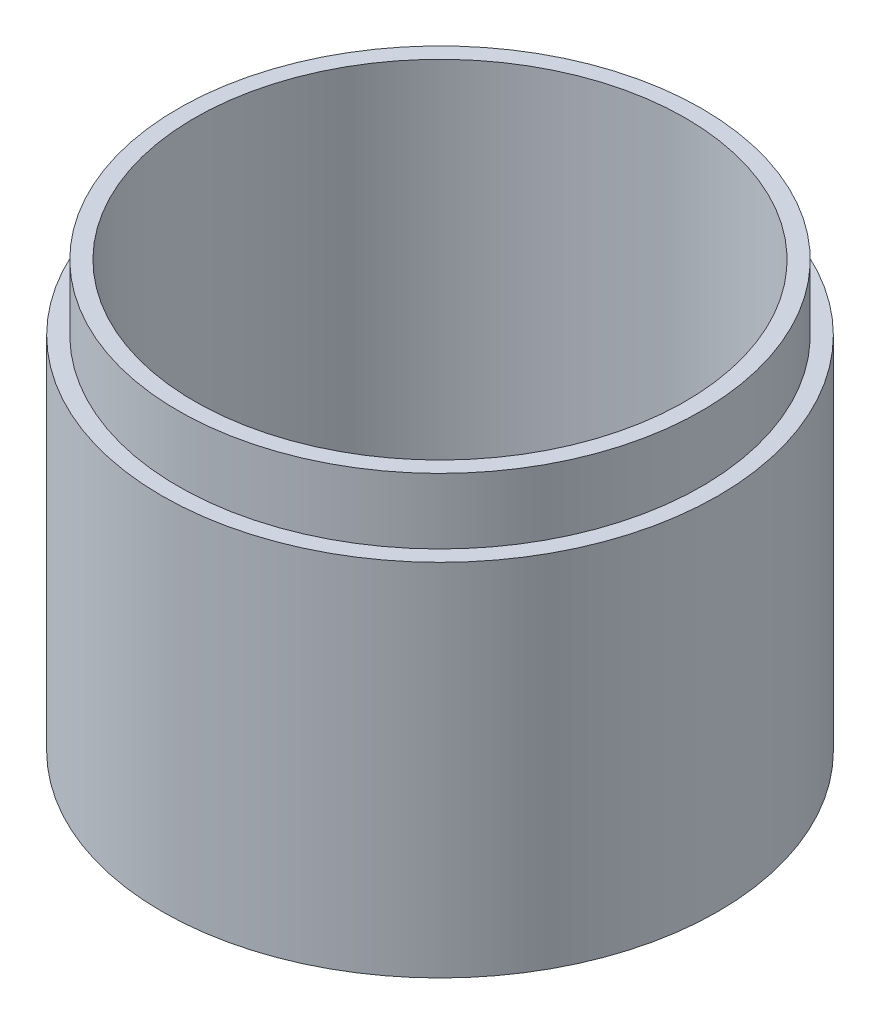
ISO-10303-21;
HEADER;
FILE_DESCRIPTION(('STEP AP214'),'2;1');
FILE_NAME('part.step','',(''),(''),'','','');
FILE_SCHEMA(('AUTOMOTIVE_DESIGN { 1 0 10303 214 1 1 1 1 }'));
ENDSEC;
DATA;
#1=APPLICATION_CONTEXT('core data for automotive mechanical design processes');
#2=APPLICATION_PROTOCOL_DEFINITION('international standard','automotive_design',2000,#1);
#3=PRODUCT_CONTEXT('',#1,'mechanical');
#4=PRODUCT('Part','Part','',(#3));
#5=PRODUCT_RELATED_PRODUCT_CATEGORY('part','',(#4));
#6=PRODUCT_DEFINITION_FORMATION('','',#4);
#7=PRODUCT_DEFINITION_CONTEXT('part definition',#1,'design');
#8=PRODUCT_DEFINITION('design','',#6,#7);
#9=PRODUCT_DEFINITION_SHAPE('','',#8);
#10=(LENGTH_UNIT() NAMED_UNIT(*) SI_UNIT(.MILLI.,.METRE.));
#11=(NAMED_UNIT(*) PLANE_ANGLE_UNIT() SI_UNIT($,.RADIAN.));
#12=(NAMED_UNIT(*) SI_UNIT($,.STERADIAN.) SOLID_ANGLE_UNIT());
#13=UNCERTAINTY_MEASURE_WITH_UNIT(LENGTH_MEASURE(1.E-05),#10,'distance_accuracy_value','');
#14=(GEOMETRIC_REPRESENTATION_CONTEXT(3) GLOBAL_UNCERTAINTY_ASSIGNED_CONTEXT((#13)) GLOBAL_UNIT_ASSIGNED_CONTEXT((#10,
#11,#12)) REPRESENTATION_CONTEXT('',''));
#15=CARTESIAN_POINT('',(0.,0.,0.));
#16=DIRECTION('',(0.,0.,1.));
#17=DIRECTION('',(1.,0.,0.));
#18=AXIS2_PLACEMENT_3D('',#15,#16,#17);
#19=CARTESIAN_POINT('',(-17.,0.,0.));
#20=DIRECTION('',(0.,1.,0.));
#21=DIRECTION('',(0.,0.,1.));
#22=AXIS2_PLACEMENT_3D('',#19,#20,#21);
#23=PLANE('',#22);
#24=CARTESIAN_POINT('',(0.,0.,0.));
#25=DIRECTION('',(0.,-1.,0.));
#26=DIRECTION('',(0.,0.,-1.));
#27=AXIS2_PLACEMENT_3D('',#24,#25,#26);
#28=CIRCLE('',#27,15.);
#29=CARTESIAN_POINT('',(0.,0.,-15.));
#30=VERTEX_POINT('',#29);
#31=EDGE_CURVE('E10',#30,#30,#28,.T.);
#32=ORIENTED_EDGE('',*,*,#31,.F.);
#33=EDGE_LOOP('',(#32));
#34=FACE_BOUND('',#33,.T.);
#35=CARTESIAN_POINT('',(0.,0.,0.));
#36=DIRECTION('',(0.,-1.,0.));
#37=DIRECTION('',(0.,0.,-1.));
#38=AXIS2_PLACEMENT_3D('',#35,#36,#37);
#39=CIRCLE('',#38,17.);
#40=CARTESIAN_POINT('',(0.,0.,-17.));
#41=VERTEX_POINT('',#40);
#42=EDGE_CURVE('E56',#41,#41,#39,.T.);
#43=ORIENTED_EDGE('',*,*,#42,.T.);
#44=EDGE_LOOP('',(#43));
#45=FACE_BOUND('',#44,.T.);
#46=ADVANCED_FACE('F34',(#34,#45),#23,.F.);
#47=CARTESIAN_POINT('',(0.,0.,0.));
#48=DIRECTION('',(0.,-1.,0.));
#49=DIRECTION('',(0.,0.,-1.));
#50=AXIS2_PLACEMENT_3D('',#47,#48,#49);
#51=CYLINDRICAL_SURFACE('',#50,15.);
#52=CARTESIAN_POINT('',(0.,26.,0.));
#53=DIRECTION('',(0.,-1.,0.));
#54=DIRECTION('',(0.,0.,-1.));
#55=AXIS2_PLACEMENT_3D('',#52,#53,#54);
#56=CIRCLE('',#55,15.);
#57=CARTESIAN_POINT('',(0.,26.,-15.));
#58=VERTEX_POINT('',#57);
#59=EDGE_CURVE('E40',#58,#58,#56,.T.);
#60=ORIENTED_EDGE('',*,*,#59,.F.);
#61=EDGE_LOOP('',(#60));
#62=FACE_BOUND('',#61,.T.);
#63=ORIENTED_EDGE('',*,*,#31,.T.);
#64=EDGE_LOOP('',(#63));
#65=FACE_BOUND('',#64,.T.);
#66=ADVANCED_FACE('F81',(#62,#65),#51,.F.);
#67=CARTESIAN_POINT('',(-15.,26.,0.));
#68=DIRECTION('',(0.,-1.,0.));
#69=DIRECTION('',(0.,0.,-1.));
#70=AXIS2_PLACEMENT_3D('',#67,#68,#69);
#71=PLANE('',#70);
#72=CARTESIAN_POINT('',(0.,26.,0.));
#73=DIRECTION('',(0.,-1.,0.));
#74=DIRECTION('',(0.,0.,-1.));
#75=AXIS2_PLACEMENT_3D('',#72,#73,#74);
#76=CIRCLE('',#75,16.);
#77=CARTESIAN_POINT('',(0.,26.,-16.));
#78=VERTEX_POINT('',#77);
#79=EDGE_CURVE('E44',#78,#78,#76,.T.);
#80=ORIENTED_EDGE('',*,*,#79,.F.);
#81=EDGE_LOOP('',(#80));
#82=FACE_BOUND('',#81,.T.);
#83=ORIENTED_EDGE('',*,*,#59,.T.);
#84=EDGE_LOOP('',(#83));
#85=FACE_BOUND('',#84,.T.);
#86=ADVANCED_FACE('F76',(#82,#85),#71,.F.);
#87=CARTESIAN_POINT('',(0.,0.,0.));
#88=DIRECTION('',(0.,-1.,0.));
#89=DIRECTION('',(0.,0.,-1.));
#90=AXIS2_PLACEMENT_3D('',#87,#88,#89);
#91=CYLINDRICAL_SURFACE('',#90,16.);
#92=CARTESIAN_POINT('',(0.,22.,0.));
#93=DIRECTION('',(0.,-1.,0.));
#94=DIRECTION('',(0.,0.,-1.));
#95=AXIS2_PLACEMENT_3D('',#92,#93,#94);
#96=CIRCLE('',#95,16.);
#97=CARTESIAN_POINT('',(0.,22.,-16.));
#98=VERTEX_POINT('',#97);
#99=EDGE_CURVE('E48',#98,#98,#96,.T.);
#100=ORIENTED_EDGE('',*,*,#99,.F.);
#101=EDGE_LOOP('',(#100));
#102=FACE_BOUND('',#101,.T.);
#103=ORIENTED_EDGE('',*,*,#79,.T.);
#104=EDGE_LOOP('',(#103));
#105=FACE_BOUND('',#104,.T.);
#106=ADVANCED_FACE('F70',(#102,#105),#91,.T.);
#107=CARTESIAN_POINT('',(-16.,22.,0.));
#108=DIRECTION('',(0.,-1.,0.));
#109=DIRECTION('',(0.,0.,-1.));
#110=AXIS2_PLACEMENT_3D('',#107,#108,#109);
#111=PLANE('',#110);
#112=CARTESIAN_POINT('',(0.,22.,0.));
#113=DIRECTION('',(0.,-1.,0.));
#114=DIRECTION('',(0.,0.,-1.));
#115=AXIS2_PLACEMENT_3D('',#112,#113,#114);
#116=CIRCLE('',#115,17.);
#117=CARTESIAN_POINT('',(0.,22.,-17.));
#118=VERTEX_POINT('',#117);
#119=EDGE_CURVE('E53',#118,#118,#116,.T.);
#120=ORIENTED_EDGE('',*,*,#119,.F.);
#121=EDGE_LOOP('',(#120));
#122=FACE_BOUND('',#121,.T.);
#123=ORIENTED_EDGE('',*,*,#99,.T.);
#124=EDGE_LOOP('',(#123));
#125=FACE_BOUND('',#124,.T.);
#126=ADVANCED_FACE('F64',(#122,#125),#111,.F.);
#127=CARTESIAN_POINT('',(0.,0.,0.));
#128=DIRECTION('',(0.,-1.,0.));
#129=DIRECTION('',(0.,0.,-1.));
#130=AXIS2_PLACEMENT_3D('',#127,#128,#129);
#131=CYLINDRICAL_SURFACE('',#130,17.);
#132=ORIENTED_EDGE('',*,*,#42,.F.);
#133=EDGE_LOOP('',(#132));
#134=FACE_BOUND('',#133,.T.);
#135=ORIENTED_EDGE('',*,*,#119,.T.);
#136=EDGE_LOOP('',(#135));
#137=FACE_BOUND('',#136,.T.);
#138=ADVANCED_FACE('F61',(#134,#137),#131,.T.);
#139=CLOSED_SHELL('',(#46,#66,#86,#106,#126,#138));
#140=MANIFOLD_SOLID_BREP('B2',#139);
#141=ADVANCED_BREP_SHAPE_REPRESENTATION('',(#18,#140),#14);
#142=SHAPE_DEFINITION_REPRESENTATION(#9,#141);
ENDSEC;
END-ISO-10303-21;
